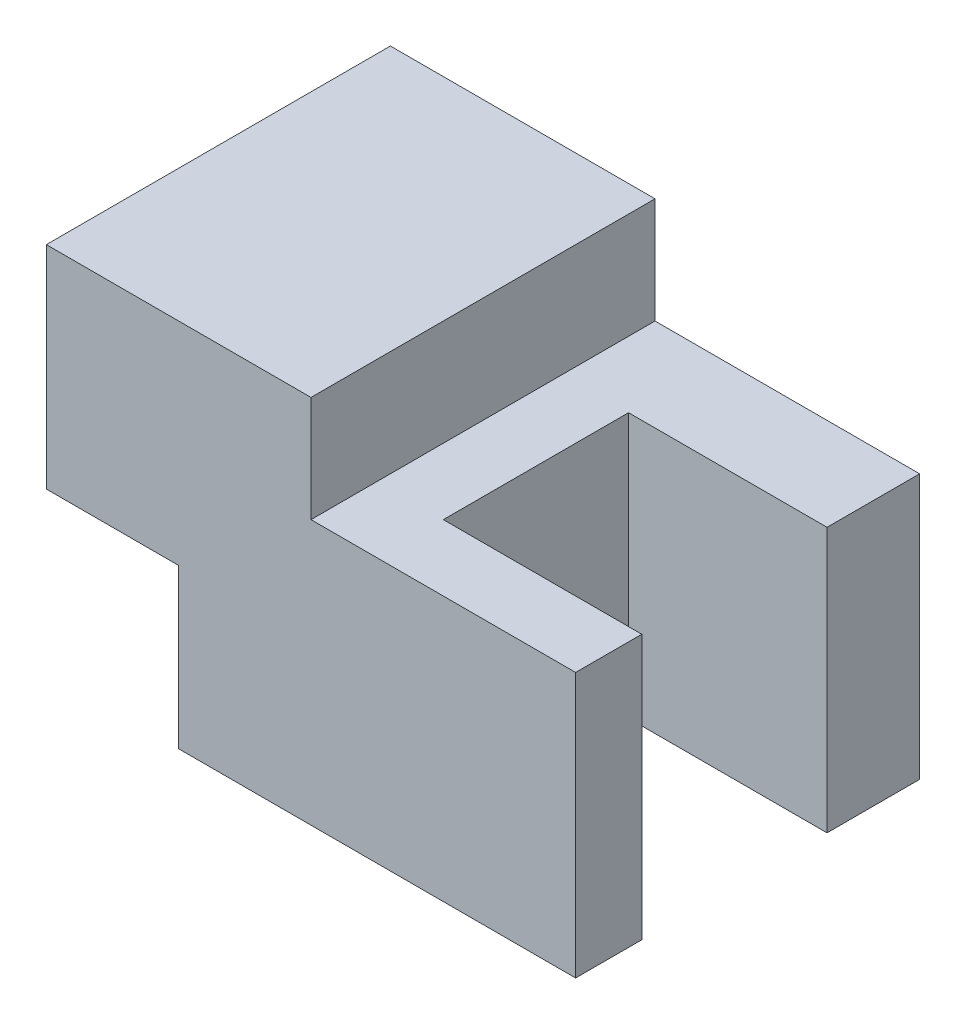
ISO-10303-21;
HEADER;
FILE_DESCRIPTION(('STEP AP214'),'2;1');
FILE_NAME('part.step','',(''),(''),'','','');
FILE_SCHEMA(('AUTOMOTIVE_DESIGN { 1 0 10303 214 1 1 1 1 }'));
ENDSEC;
DATA;
#1=APPLICATION_CONTEXT('core data for automotive mechanical design processes');
#2=APPLICATION_PROTOCOL_DEFINITION('international standard','automotive_design',2000,#1);
#3=PRODUCT_CONTEXT('',#1,'mechanical');
#4=PRODUCT('Part','Part','',(#3));
#5=PRODUCT_RELATED_PRODUCT_CATEGORY('part','',(#4));
#6=PRODUCT_DEFINITION_FORMATION('','',#4);
#7=PRODUCT_DEFINITION_CONTEXT('part definition',#1,'design');
#8=PRODUCT_DEFINITION('design','',#6,#7);
#9=PRODUCT_DEFINITION_SHAPE('','',#8);
#10=(LENGTH_UNIT() NAMED_UNIT(*) SI_UNIT(.MILLI.,.METRE.));
#11=(NAMED_UNIT(*) PLANE_ANGLE_UNIT() SI_UNIT($,.RADIAN.));
#12=(NAMED_UNIT(*) SI_UNIT($,.STERADIAN.) SOLID_ANGLE_UNIT());
#13=UNCERTAINTY_MEASURE_WITH_UNIT(LENGTH_MEASURE(1.E-05),#10,'distance_accuracy_value','');
#14=(GEOMETRIC_REPRESENTATION_CONTEXT(3) GLOBAL_UNCERTAINTY_ASSIGNED_CONTEXT((#13)) GLOBAL_UNIT_ASSIGNED_CONTEXT((#10,
#11,#12)) REPRESENTATION_CONTEXT('',''));
#15=CARTESIAN_POINT('',(0.,0.,0.));
#16=DIRECTION('',(0.,0.,1.));
#17=DIRECTION('',(1.,0.,0.));
#18=AXIS2_PLACEMENT_3D('',#15,#16,#17);
#19=CARTESIAN_POINT('',(1524.,1016.,1320.8));
#20=DIRECTION('',(-1.,0.,0.));
#21=DIRECTION('',(0.,-1.,0.));
#22=AXIS2_PLACEMENT_3D('',#19,#20,#21);
#23=PLANE('',#22);
#24=DIRECTION('',(0.,1.,0.));
#25=VECTOR('',#24,1.);
#26=CARTESIAN_POINT('',(1524.,0.,355.6));
#27=LINE('',#26,#25);
#28=CARTESIAN_POINT('',(1524.,0.,355.6));
#29=VERTEX_POINT('',#28);
#30=CARTESIAN_POINT('',(1524.,1016.,355.6));
#31=VERTEX_POINT('',#30);
#32=EDGE_CURVE('E61',#29,#31,#27,.T.);
#33=ORIENTED_EDGE('',*,*,#32,.F.);
#34=DIRECTION('',(0.,0.,-1.));
#35=VECTOR('',#34,1.);
#36=CARTESIAN_POINT('',(1524.,0.,1320.8));
#37=LINE('',#36,#35);
#38=CARTESIAN_POINT('',(1524.,0.,0.));
#39=VERTEX_POINT('',#38);
#40=EDGE_CURVE('E193',#29,#39,#37,.T.);
#41=ORIENTED_EDGE('',*,*,#40,.T.);
#42=DIRECTION('',(0.,1.,0.));
#43=VECTOR('',#42,1.);
#44=CARTESIAN_POINT('',(1524.,1016.,0.));
#45=LINE('',#44,#43);
#46=CARTESIAN_POINT('',(1524.,1016.,0.));
#47=VERTEX_POINT('',#46);
#48=EDGE_CURVE('E174',#39,#47,#45,.T.);
#49=ORIENTED_EDGE('',*,*,#48,.T.);
#50=DIRECTION('',(0.,0.,-1.));
#51=VECTOR('',#50,1.);
#52=CARTESIAN_POINT('',(1524.,1016.,1320.8));
#53=LINE('',#52,#51);
#54=EDGE_CURVE('E148',#31,#47,#53,.T.);
#55=ORIENTED_EDGE('',*,*,#54,.F.);
#56=EDGE_LOOP('',(#33,#41,#49,#55));
#57=FACE_BOUND('',#56,.T.);
#58=ADVANCED_FACE('F45',(#57),#23,.F.);
#59=CARTESIAN_POINT('',(-508.,1422.4,1320.8));
#60=DIRECTION('',(1.,0.,0.));
#61=DIRECTION('',(0.,0.,-1.));
#62=AXIS2_PLACEMENT_3D('',#59,#60,#61);
#63=PLANE('',#62);
#64=DIRECTION('',(0.,-1.,0.));
#65=VECTOR('',#64,1.);
#66=CARTESIAN_POINT('',(-508.,1422.4,0.));
#67=LINE('',#66,#65);
#68=CARTESIAN_POINT('',(-508.,1422.4,0.));
#69=VERTEX_POINT('',#68);
#70=CARTESIAN_POINT('',(-508.,609.6,0.));
#71=VERTEX_POINT('',#70);
#72=EDGE_CURVE('E159',#69,#71,#67,.T.);
#73=ORIENTED_EDGE('',*,*,#72,.T.);
#74=DIRECTION('',(0.,0.,-1.));
#75=VECTOR('',#74,1.);
#76=CARTESIAN_POINT('',(-508.,609.6,1320.8));
#77=LINE('',#76,#75);
#78=CARTESIAN_POINT('',(-508.,609.6,1320.8));
#79=VERTEX_POINT('',#78);
#80=EDGE_CURVE('E11',#79,#71,#77,.T.);
#81=ORIENTED_EDGE('',*,*,#80,.F.);
#82=DIRECTION('',(0.,-1.,0.));
#83=VECTOR('',#82,1.);
#84=CARTESIAN_POINT('',(-508.,1422.4,1320.8));
#85=LINE('',#84,#83);
#86=CARTESIAN_POINT('',(-508.,1422.4,1320.8));
#87=VERTEX_POINT('',#86);
#88=EDGE_CURVE('E185',#87,#79,#85,.T.);
#89=ORIENTED_EDGE('',*,*,#88,.F.);
#90=DIRECTION('',(0.,0.,-1.));
#91=VECTOR('',#90,1.);
#92=CARTESIAN_POINT('',(-508.,1422.4,1320.8));
#93=LINE('',#92,#91);
#94=EDGE_CURVE('E155',#87,#69,#93,.T.);
#95=ORIENTED_EDGE('',*,*,#94,.T.);
#96=EDGE_LOOP('',(#73,#81,#89,#95));
#97=FACE_BOUND('',#96,.T.);
#98=ADVANCED_FACE('F47',(#97),#63,.F.);
#99=CARTESIAN_POINT('',(-508.,609.6,1320.8));
#100=DIRECTION('',(0.,1.,0.));
#101=DIRECTION('',(0.,0.,1.));
#102=AXIS2_PLACEMENT_3D('',#99,#100,#101);
#103=PLANE('',#102);
#104=DIRECTION('',(1.,0.,0.));
#105=VECTOR('',#104,1.);
#106=CARTESIAN_POINT('',(-508.,609.6,0.));
#107=LINE('',#106,#105);
#108=CARTESIAN_POINT('',(0.,609.6,0.));
#109=VERTEX_POINT('',#108);
#110=EDGE_CURVE('E163',#71,#109,#107,.T.);
#111=ORIENTED_EDGE('',*,*,#110,.T.);
#112=DIRECTION('',(0.,0.,-1.));
#113=VECTOR('',#112,1.);
#114=CARTESIAN_POINT('',(0.,609.6,1320.8));
#115=LINE('',#114,#113);
#116=CARTESIAN_POINT('',(0.,609.6,1320.8));
#117=VERTEX_POINT('',#116);
#118=EDGE_CURVE('E54',#117,#109,#115,.T.);
#119=ORIENTED_EDGE('',*,*,#118,.F.);
#120=DIRECTION('',(1.,0.,0.));
#121=VECTOR('',#120,1.);
#122=CARTESIAN_POINT('',(-508.,609.6,1320.8));
#123=LINE('',#122,#121);
#124=EDGE_CURVE('E111',#79,#117,#123,.T.);
#125=ORIENTED_EDGE('',*,*,#124,.F.);
#126=ORIENTED_EDGE('',*,*,#80,.T.);
#127=EDGE_LOOP('',(#111,#119,#125,#126));
#128=FACE_BOUND('',#127,.T.);
#129=ADVANCED_FACE('F310',(#128),#103,.F.);
#130=CARTESIAN_POINT('',(0.,609.6,1320.8));
#131=DIRECTION('',(1.,0.,0.));
#132=DIRECTION('',(0.,0.,-1.));
#133=AXIS2_PLACEMENT_3D('',#130,#131,#132);
#134=PLANE('',#133);
#135=DIRECTION('',(0.,-1.,0.));
#136=VECTOR('',#135,1.);
#137=CARTESIAN_POINT('',(0.,609.6,0.));
#138=LINE('',#137,#136);
#139=CARTESIAN_POINT('',(0.,0.,0.));
#140=VERTEX_POINT('',#139);
#141=EDGE_CURVE('E167',#109,#140,#138,.T.);
#142=ORIENTED_EDGE('',*,*,#141,.T.);
#143=DIRECTION('',(0.,0.,-1.));
#144=VECTOR('',#143,1.);
#145=CARTESIAN_POINT('',(0.,0.,1320.8));
#146=LINE('',#145,#144);
#147=CARTESIAN_POINT('',(0.,0.,1320.8));
#148=VERTEX_POINT('',#147);
#149=EDGE_CURVE('E198',#148,#140,#146,.T.);
#150=ORIENTED_EDGE('',*,*,#149,.F.);
#151=DIRECTION('',(0.,-1.,0.));
#152=VECTOR('',#151,1.);
#153=CARTESIAN_POINT('',(0.,609.6,1320.8));
#154=LINE('',#153,#152);
#155=EDGE_CURVE('E208',#117,#148,#154,.T.);
#156=ORIENTED_EDGE('',*,*,#155,.F.);
#157=ORIENTED_EDGE('',*,*,#118,.T.);
#158=EDGE_LOOP('',(#142,#150,#156,#157));
#159=FACE_BOUND('',#158,.T.);
#160=ADVANCED_FACE('F206',(#159),#134,.F.);
#161=CARTESIAN_POINT('',(0.,0.,1320.8));
#162=DIRECTION('',(0.,1.,0.));
#163=DIRECTION('',(0.,0.,1.));
#164=AXIS2_PLACEMENT_3D('',#161,#162,#163);
#165=PLANE('',#164);
#166=DIRECTION('',(0.,0.,1.));
#167=VECTOR('',#166,1.);
#168=CARTESIAN_POINT('',(762.,0.,355.6));
#169=LINE('',#168,#167);
#170=CARTESIAN_POINT('',(762.,0.,355.6));
#171=VERTEX_POINT('',#170);
#172=CARTESIAN_POINT('',(762.,0.,1066.8));
#173=VERTEX_POINT('',#172);
#174=EDGE_CURVE('E238',#171,#173,#169,.T.);
#175=ORIENTED_EDGE('',*,*,#174,.T.);
#176=DIRECTION('',(1.,0.,0.));
#177=VECTOR('',#176,1.);
#178=CARTESIAN_POINT('',(762.,0.,1066.8));
#179=LINE('',#178,#177);
#180=CARTESIAN_POINT('',(1524.,0.,1066.8));
#181=VERTEX_POINT('',#180);
#182=EDGE_CURVE('E252',#173,#181,#179,.T.);
#183=ORIENTED_EDGE('',*,*,#182,.T.);
#184=CARTESIAN_POINT('',(1524.,0.,1320.8));
#185=VERTEX_POINT('',#184);
#186=EDGE_CURVE('E194',#185,#181,#37,.T.);
#187=ORIENTED_EDGE('',*,*,#186,.F.);
#188=DIRECTION('',(1.,0.,0.));
#189=VECTOR('',#188,1.);
#190=CARTESIAN_POINT('',(0.,0.,1320.8));
#191=LINE('',#190,#189);
#192=EDGE_CURVE('E222',#148,#185,#191,.T.);
#193=ORIENTED_EDGE('',*,*,#192,.F.);
#194=ORIENTED_EDGE('',*,*,#149,.T.);
#195=DIRECTION('',(1.,0.,0.));
#196=VECTOR('',#195,1.);
#197=CARTESIAN_POINT('',(0.,0.,0.));
#198=LINE('',#197,#196);
#199=EDGE_CURVE('E170',#140,#39,#198,.T.);
#200=ORIENTED_EDGE('',*,*,#199,.T.);
#201=ORIENTED_EDGE('',*,*,#40,.F.);
#202=DIRECTION('',(1.,0.,0.));
#203=VECTOR('',#202,1.);
#204=CARTESIAN_POINT('',(762.,0.,355.6));
#205=LINE('',#204,#203);
#206=EDGE_CURVE('E262',#171,#29,#205,.T.);
#207=ORIENTED_EDGE('',*,*,#206,.F.);
#208=EDGE_LOOP('',(#175,#183,#187,#193,#194,#200,#201,#207));
#209=FACE_BOUND('',#208,.T.);
#210=ADVANCED_FACE('F217',(#209),#165,.F.);
#211=ORIENTED_EDGE('',*,*,#186,.T.);
#212=DIRECTION('',(0.,1.,0.));
#213=VECTOR('',#212,1.);
#214=CARTESIAN_POINT('',(1524.,0.,1066.8));
#215=LINE('',#214,#213);
#216=CARTESIAN_POINT('',(1524.,1016.,1066.8));
#217=VERTEX_POINT('',#216);
#218=EDGE_CURVE('E234',#181,#217,#215,.T.);
#219=ORIENTED_EDGE('',*,*,#218,.T.);
#220=CARTESIAN_POINT('',(1524.,1016.,1320.8));
#221=VERTEX_POINT('',#220);
#222=EDGE_CURVE('E190',#221,#217,#53,.T.);
#223=ORIENTED_EDGE('',*,*,#222,.F.);
#224=DIRECTION('',(0.,1.,0.));
#225=VECTOR('',#224,1.);
#226=CARTESIAN_POINT('',(1524.,1016.,1320.8));
#227=LINE('',#226,#225);
#228=EDGE_CURVE('E134',#185,#221,#227,.T.);
#229=ORIENTED_EDGE('',*,*,#228,.F.);
#230=EDGE_LOOP('',(#211,#219,#223,#229));
#231=FACE_BOUND('',#230,.T.);
#232=ADVANCED_FACE('F273',(#231),#23,.F.);
#233=CARTESIAN_POINT('',(508.,1016.,1320.8));
#234=DIRECTION('',(0.,-1.,0.));
#235=DIRECTION('',(0.,0.,-1.));
#236=AXIS2_PLACEMENT_3D('',#233,#234,#235);
#237=PLANE('',#236);
#238=ORIENTED_EDGE('',*,*,#222,.T.);
#239=DIRECTION('',(1.,0.,0.));
#240=VECTOR('',#239,1.);
#241=CARTESIAN_POINT('',(762.,1016.,1066.8));
#242=LINE('',#241,#240);
#243=CARTESIAN_POINT('',(762.,1016.,1066.8));
#244=VERTEX_POINT('',#243);
#245=EDGE_CURVE('E256',#244,#217,#242,.T.);
#246=ORIENTED_EDGE('',*,*,#245,.F.);
#247=DIRECTION('',(0.,0.,1.));
#248=VECTOR('',#247,1.);
#249=CARTESIAN_POINT('',(762.,1016.,355.6));
#250=LINE('',#249,#248);
#251=CARTESIAN_POINT('',(762.,1016.,355.6));
#252=VERTEX_POINT('',#251);
#253=EDGE_CURVE('E248',#252,#244,#250,.T.);
#254=ORIENTED_EDGE('',*,*,#253,.F.);
#255=DIRECTION('',(1.,0.,0.));
#256=VECTOR('',#255,1.);
#257=CARTESIAN_POINT('',(762.,1016.,355.6));
#258=LINE('',#257,#256);
#259=EDGE_CURVE('E253',#252,#31,#258,.T.);
#260=ORIENTED_EDGE('',*,*,#259,.T.);
#261=ORIENTED_EDGE('',*,*,#54,.T.);
#262=DIRECTION('',(-1.,0.,0.));
#263=VECTOR('',#262,1.);
#264=CARTESIAN_POINT('',(508.,1016.,0.));
#265=LINE('',#264,#263);
#266=CARTESIAN_POINT('',(508.,1016.,0.));
#267=VERTEX_POINT('',#266);
#268=EDGE_CURVE('E144',#47,#267,#265,.T.);
#269=ORIENTED_EDGE('',*,*,#268,.T.);
#270=DIRECTION('',(0.,0.,-1.));
#271=VECTOR('',#270,1.);
#272=CARTESIAN_POINT('',(508.,1016.,1320.8));
#273=LINE('',#272,#271);
#274=CARTESIAN_POINT('',(508.,1016.,1320.8));
#275=VERTEX_POINT('',#274);
#276=EDGE_CURVE('E141',#275,#267,#273,.T.);
#277=ORIENTED_EDGE('',*,*,#276,.F.);
#278=DIRECTION('',(-1.,0.,0.));
#279=VECTOR('',#278,1.);
#280=CARTESIAN_POINT('',(508.,1016.,1320.8));
#281=LINE('',#280,#279);
#282=EDGE_CURVE('E127',#221,#275,#281,.T.);
#283=ORIENTED_EDGE('',*,*,#282,.F.);
#284=EDGE_LOOP('',(#238,#246,#254,#260,#261,#269,#277,#283));
#285=FACE_BOUND('',#284,.T.);
#286=ADVANCED_FACE('F142',(#285),#237,.F.);
#287=CARTESIAN_POINT('',(508.,1422.4,1320.8));
#288=DIRECTION('',(-1.,0.,0.));
#289=DIRECTION('',(0.,-1.,0.));
#290=AXIS2_PLACEMENT_3D('',#287,#288,#289);
#291=PLANE('',#290);
#292=DIRECTION('',(0.,1.,0.));
#293=VECTOR('',#292,1.);
#294=CARTESIAN_POINT('',(508.,1422.4,0.));
#295=LINE('',#294,#293);
#296=CARTESIAN_POINT('',(508.,1422.4,0.));
#297=VERTEX_POINT('',#296);
#298=EDGE_CURVE('E180',#267,#297,#295,.T.);
#299=ORIENTED_EDGE('',*,*,#298,.T.);
#300=DIRECTION('',(0.,0.,-1.));
#301=VECTOR('',#300,1.);
#302=CARTESIAN_POINT('',(508.,1422.4,1320.8));
#303=LINE('',#302,#301);
#304=CARTESIAN_POINT('',(508.,1422.4,1320.8));
#305=VERTEX_POINT('',#304);
#306=EDGE_CURVE('E149',#305,#297,#303,.T.);
#307=ORIENTED_EDGE('',*,*,#306,.F.);
#308=DIRECTION('',(0.,1.,0.));
#309=VECTOR('',#308,1.);
#310=CARTESIAN_POINT('',(508.,1422.4,1320.8));
#311=LINE('',#310,#309);
#312=EDGE_CURVE('E131',#275,#305,#311,.T.);
#313=ORIENTED_EDGE('',*,*,#312,.F.);
#314=ORIENTED_EDGE('',*,*,#276,.T.);
#315=EDGE_LOOP('',(#299,#307,#313,#314));
#316=FACE_BOUND('',#315,.T.);
#317=ADVANCED_FACE('F151',(#316),#291,.F.);
#318=CARTESIAN_POINT('',(-508.,1422.4,1320.8));
#319=DIRECTION('',(0.,-1.,0.));
#320=DIRECTION('',(0.,0.,-1.));
#321=AXIS2_PLACEMENT_3D('',#318,#319,#320);
#322=PLANE('',#321);
#323=DIRECTION('',(-1.,0.,0.));
#324=VECTOR('',#323,1.);
#325=CARTESIAN_POINT('',(-508.,1422.4,0.));
#326=LINE('',#325,#324);
#327=EDGE_CURVE('E103',#297,#69,#326,.T.);
#328=ORIENTED_EDGE('',*,*,#327,.T.);
#329=ORIENTED_EDGE('',*,*,#94,.F.);
#330=DIRECTION('',(-1.,0.,0.));
#331=VECTOR('',#330,1.);
#332=CARTESIAN_POINT('',(-508.,1422.4,1320.8));
#333=LINE('',#332,#331);
#334=EDGE_CURVE('E70',#305,#87,#333,.T.);
#335=ORIENTED_EDGE('',*,*,#334,.F.);
#336=ORIENTED_EDGE('',*,*,#306,.T.);
#337=EDGE_LOOP('',(#328,#329,#335,#336));
#338=FACE_BOUND('',#337,.T.);
#339=ADVANCED_FACE('F326',(#338),#322,.F.);
#340=CARTESIAN_POINT('',(0.,0.,1320.8));
#341=DIRECTION('',(0.,0.,1.));
#342=DIRECTION('',(1.,0.,0.));
#343=AXIS2_PLACEMENT_3D('',#340,#341,#342);
#344=PLANE('',#343);
#345=ORIENTED_EDGE('',*,*,#88,.T.);
#346=ORIENTED_EDGE('',*,*,#124,.T.);
#347=ORIENTED_EDGE('',*,*,#155,.T.);
#348=ORIENTED_EDGE('',*,*,#192,.T.);
#349=ORIENTED_EDGE('',*,*,#228,.T.);
#350=ORIENTED_EDGE('',*,*,#282,.T.);
#351=ORIENTED_EDGE('',*,*,#312,.T.);
#352=ORIENTED_EDGE('',*,*,#334,.T.);
#353=EDGE_LOOP('',(#345,#346,#347,#348,#349,#350,#351,#352));
#354=FACE_BOUND('',#353,.T.);
#355=ADVANCED_FACE('F129',(#354),#344,.T.);
#356=CARTESIAN_POINT('',(0.,0.,0.));
#357=DIRECTION('',(0.,0.,1.));
#358=DIRECTION('',(1.,0.,0.));
#359=AXIS2_PLACEMENT_3D('',#356,#357,#358);
#360=PLANE('',#359);
#361=ORIENTED_EDGE('',*,*,#72,.F.);
#362=ORIENTED_EDGE('',*,*,#327,.F.);
#363=ORIENTED_EDGE('',*,*,#298,.F.);
#364=ORIENTED_EDGE('',*,*,#268,.F.);
#365=ORIENTED_EDGE('',*,*,#48,.F.);
#366=ORIENTED_EDGE('',*,*,#199,.F.);
#367=ORIENTED_EDGE('',*,*,#141,.F.);
#368=ORIENTED_EDGE('',*,*,#110,.F.);
#369=EDGE_LOOP('',(#361,#362,#363,#364,#365,#366,#367,#368));
#370=FACE_BOUND('',#369,.T.);
#371=ADVANCED_FACE('F212',(#370),#360,.F.);
#372=CARTESIAN_POINT('',(762.,0.,1066.8));
#373=DIRECTION('',(0.,0.,1.));
#374=DIRECTION('',(1.,0.,0.));
#375=AXIS2_PLACEMENT_3D('',#372,#373,#374);
#376=PLANE('',#375);
#377=ORIENTED_EDGE('',*,*,#245,.T.);
#378=ORIENTED_EDGE('',*,*,#218,.F.);
#379=ORIENTED_EDGE('',*,*,#182,.F.);
#380=DIRECTION('',(0.,1.,0.));
#381=VECTOR('',#380,1.);
#382=CARTESIAN_POINT('',(762.,0.,1066.8));
#383=LINE('',#382,#381);
#384=EDGE_CURVE('E164',#173,#244,#383,.T.);
#385=ORIENTED_EDGE('',*,*,#384,.T.);
#386=EDGE_LOOP('',(#377,#378,#379,#385));
#387=FACE_BOUND('',#386,.T.);
#388=ADVANCED_FACE('F292',(#387),#376,.F.);
#389=CARTESIAN_POINT('',(762.,0.,355.6));
#390=DIRECTION('',(-1.,0.,0.));
#391=DIRECTION('',(0.,0.,1.));
#392=AXIS2_PLACEMENT_3D('',#389,#390,#391);
#393=PLANE('',#392);
#394=ORIENTED_EDGE('',*,*,#253,.T.);
#395=ORIENTED_EDGE('',*,*,#384,.F.);
#396=ORIENTED_EDGE('',*,*,#174,.F.);
#397=DIRECTION('',(0.,1.,0.));
#398=VECTOR('',#397,1.);
#399=CARTESIAN_POINT('',(762.,0.,355.6));
#400=LINE('',#399,#398);
#401=EDGE_CURVE('E241',#171,#252,#400,.T.);
#402=ORIENTED_EDGE('',*,*,#401,.T.);
#403=EDGE_LOOP('',(#394,#395,#396,#402));
#404=FACE_BOUND('',#403,.T.);
#405=ADVANCED_FACE('F291',(#404),#393,.F.);
#406=CARTESIAN_POINT('',(762.,0.,355.6));
#407=DIRECTION('',(0.,0.,1.));
#408=DIRECTION('',(1.,0.,0.));
#409=AXIS2_PLACEMENT_3D('',#406,#407,#408);
#410=PLANE('',#409);
#411=ORIENTED_EDGE('',*,*,#259,.F.);
#412=ORIENTED_EDGE('',*,*,#401,.F.);
#413=ORIENTED_EDGE('',*,*,#206,.T.);
#414=ORIENTED_EDGE('',*,*,#32,.T.);
#415=EDGE_LOOP('',(#411,#412,#413,#414));
#416=FACE_BOUND('',#415,.T.);
#417=ADVANCED_FACE('F285',(#416),#410,.T.);
#418=CLOSED_SHELL('',(#58,#98,#129,#160,#210,#232,#286,#317,#339,#355,#371,#388,#405,#417));
#419=MANIFOLD_SOLID_BREP('B2',#418);
#420=ADVANCED_BREP_SHAPE_REPRESENTATION('',(#18,#419),#14);
#421=SHAPE_DEFINITION_REPRESENTATION(#9,#420);
ENDSEC;
END-ISO-10303-21;
